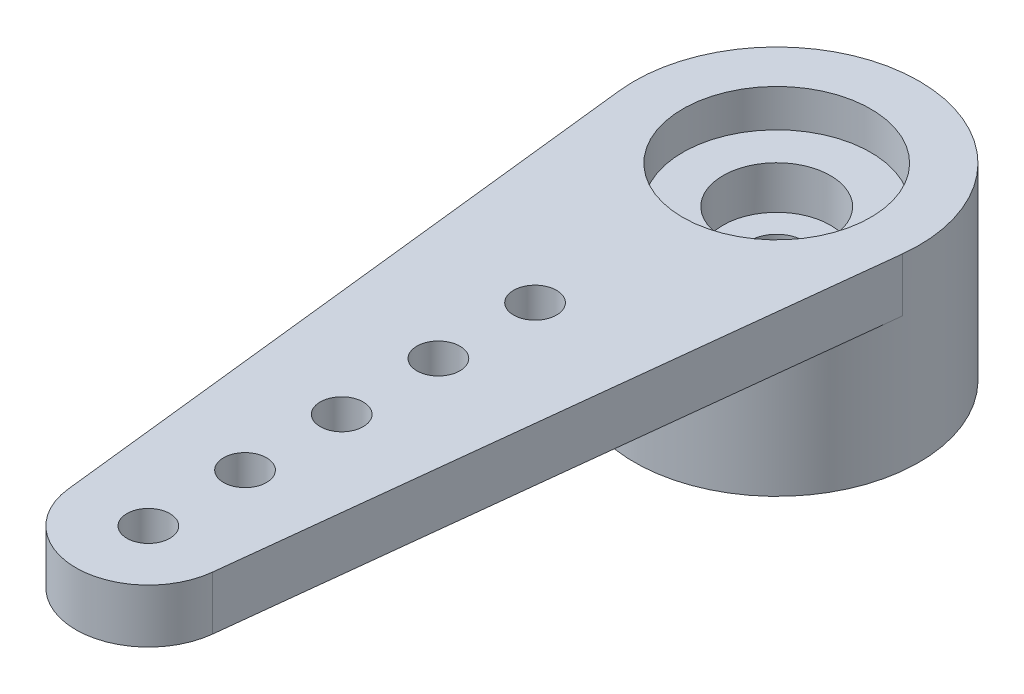
ISO-10303-21;
HEADER;
FILE_DESCRIPTION(('STEP AP214'),'2;1');
FILE_NAME('part.step','',(''),(''),'','','');
FILE_SCHEMA(('AUTOMOTIVE_DESIGN { 1 0 10303 214 1 1 1 1 }'));
ENDSEC;
DATA;
#1=APPLICATION_CONTEXT('core data for automotive mechanical design processes');
#2=APPLICATION_PROTOCOL_DEFINITION('international standard','automotive_design',2000,#1);
#3=PRODUCT_CONTEXT('',#1,'mechanical');
#4=PRODUCT('Part','Part','',(#3));
#5=PRODUCT_RELATED_PRODUCT_CATEGORY('part','',(#4));
#6=PRODUCT_DEFINITION_FORMATION('','',#4);
#7=PRODUCT_DEFINITION_CONTEXT('part definition',#1,'design');
#8=PRODUCT_DEFINITION('design','',#6,#7);
#9=PRODUCT_DEFINITION_SHAPE('','',#8);
#10=(LENGTH_UNIT() NAMED_UNIT(*) SI_UNIT(.MILLI.,.METRE.));
#11=(NAMED_UNIT(*) PLANE_ANGLE_UNIT() SI_UNIT($,.RADIAN.));
#12=(NAMED_UNIT(*) SI_UNIT($,.STERADIAN.) SOLID_ANGLE_UNIT());
#13=UNCERTAINTY_MEASURE_WITH_UNIT(LENGTH_MEASURE(1.E-05),#10,'distance_accuracy_value','');
#14=(GEOMETRIC_REPRESENTATION_CONTEXT(3) GLOBAL_UNCERTAINTY_ASSIGNED_CONTEXT((#13)) GLOBAL_UNIT_ASSIGNED_CONTEXT((#10,
#11,#12)) REPRESENTATION_CONTEXT('',''));
#15=CARTESIAN_POINT('',(0.,0.,0.));
#16=DIRECTION('',(0.,0.,1.));
#17=DIRECTION('',(1.,0.,0.));
#18=AXIS2_PLACEMENT_3D('',#15,#16,#17);
#19=CARTESIAN_POINT('',(0.,-3.176,0.));
#20=DIRECTION('',(0.,1.,0.));
#21=DIRECTION('',(0.,0.,1.));
#22=AXIS2_PLACEMENT_3D('',#19,#20,#21);
#23=CYLINDRICAL_SURFACE('',#22,1.27);
#24=CARTESIAN_POINT('',(0.,0.381,0.));
#25=DIRECTION('',(0.,1.,0.));
#26=DIRECTION('',(0.,0.,1.));
#27=AXIS2_PLACEMENT_3D('',#24,#25,#26);
#28=CIRCLE('',#27,1.27);
#29=CARTESIAN_POINT('',(0.,0.381,1.27));
#30=VERTEX_POINT('',#29);
#31=EDGE_CURVE('E244',#30,#30,#28,.T.);
#32=ORIENTED_EDGE('',*,*,#31,.T.);
#33=EDGE_LOOP('',(#32));
#34=FACE_BOUND('',#33,.T.);
#35=CARTESIAN_POINT('',(0.,-0.635,0.));
#36=DIRECTION('',(0.,-1.,0.));
#37=DIRECTION('',(0.,0.,-1.));
#38=AXIS2_PLACEMENT_3D('',#35,#36,#37);
#39=CIRCLE('',#38,1.27);
#40=CARTESIAN_POINT('',(0.,-0.635,-1.27));
#41=VERTEX_POINT('',#40);
#42=EDGE_CURVE('E11',#41,#41,#39,.F.);
#43=ORIENTED_EDGE('',*,*,#42,.F.);
#44=EDGE_LOOP('',(#43));
#45=FACE_BOUND('',#44,.T.);
#46=ADVANCED_FACE('F45',(#34,#45),#23,.F.);
#47=CARTESIAN_POINT('',(0.,0.,14.859));
#48=DIRECTION('',(0.,1.,0.));
#49=DIRECTION('',(0.,0.,1.));
#50=AXIS2_PLACEMENT_3D('',#47,#48,#49);
#51=PLANE('',#50);
#52=CARTESIAN_POINT('',(0.,0.,5.715));
#53=DIRECTION('',(0.,1.,0.));
#54=DIRECTION('',(0.,0.,1.));
#55=AXIS2_PLACEMENT_3D('',#52,#53,#54);
#56=CIRCLE('',#55,0.508);
#57=CARTESIAN_POINT('',(0.,0.,6.223));
#58=VERTEX_POINT('',#57);
#59=EDGE_CURVE('E208',#58,#58,#56,.F.);
#60=ORIENTED_EDGE('',*,*,#59,.F.);
#61=EDGE_LOOP('',(#60));
#62=FACE_BOUND('',#61,.T.);
#63=CARTESIAN_POINT('',(0.,0.,8.001));
#64=DIRECTION('',(0.,1.,0.));
#65=DIRECTION('',(0.,0.,1.));
#66=AXIS2_PLACEMENT_3D('',#63,#64,#65);
#67=CIRCLE('',#66,0.508);
#68=CARTESIAN_POINT('',(0.,0.,8.509));
#69=VERTEX_POINT('',#68);
#70=EDGE_CURVE('E216',#69,#69,#67,.F.);
#71=ORIENTED_EDGE('',*,*,#70,.F.);
#72=EDGE_LOOP('',(#71));
#73=FACE_BOUND('',#72,.T.);
#74=CARTESIAN_POINT('',(0.,0.,10.287));
#75=DIRECTION('',(0.,1.,0.));
#76=DIRECTION('',(0.,0.,1.));
#77=AXIS2_PLACEMENT_3D('',#74,#75,#76);
#78=CIRCLE('',#77,0.508);
#79=CARTESIAN_POINT('',(0.,0.,10.795));
#80=VERTEX_POINT('',#79);
#81=EDGE_CURVE('E224',#80,#80,#78,.F.);
#82=ORIENTED_EDGE('',*,*,#81,.F.);
#83=EDGE_LOOP('',(#82));
#84=FACE_BOUND('',#83,.T.);
#85=CARTESIAN_POINT('',(0.,0.,12.573));
#86=DIRECTION('',(0.,1.,0.));
#87=DIRECTION('',(0.,0.,1.));
#88=AXIS2_PLACEMENT_3D('',#85,#86,#87);
#89=CIRCLE('',#88,0.508);
#90=CARTESIAN_POINT('',(0.,0.,13.081));
#91=VERTEX_POINT('',#90);
#92=EDGE_CURVE('E232',#91,#91,#89,.F.);
#93=ORIENTED_EDGE('',*,*,#92,.F.);
#94=EDGE_LOOP('',(#93));
#95=FACE_BOUND('',#94,.T.);
#96=CARTESIAN_POINT('',(0.,0.,14.859));
#97=DIRECTION('',(0.,1.,0.));
#98=DIRECTION('',(0.,0.,1.));
#99=AXIS2_PLACEMENT_3D('',#96,#97,#98);
#100=CIRCLE('',#99,0.508);
#101=CARTESIAN_POINT('',(0.,0.,15.367));
#102=VERTEX_POINT('',#101);
#103=EDGE_CURVE('E240',#102,#102,#100,.F.);
#104=ORIENTED_EDGE('',*,*,#103,.F.);
#105=EDGE_LOOP('',(#104));
#106=FACE_BOUND('',#105,.T.);
#107=CARTESIAN_POINT('',(0.,0.,0.));
#108=DIRECTION('',(0.,-1.,0.));
#109=DIRECTION('',(0.,0.,-1.));
#110=AXIS2_PLACEMENT_3D('',#107,#108,#109);
#111=CIRCLE('',#110,3.3655);
#112=CARTESIAN_POINT('',(3.34466079034469,0.,0.373944444444445));
#113=VERTEX_POINT('',#112);
#114=CARTESIAN_POINT('',(-3.34466079034469,0.,0.373944444444445));
#115=VERTEX_POINT('',#114);
#116=EDGE_CURVE('E78',#113,#115,#111,.T.);
#117=ORIENTED_EDGE('',*,*,#116,.F.);
#118=DIRECTION('',(0.111111111111111,0.,-0.993807989999907));
#119=VECTOR('',#118,1.);
#120=CARTESIAN_POINT('',(1.70388379885484,0.,15.0495));
#121=LINE('',#120,#119);
#122=CARTESIAN_POINT('',(1.70388379885484,0.,15.0495));
#123=VERTEX_POINT('',#122);
#124=EDGE_CURVE('E98',#123,#113,#121,.T.);
#125=ORIENTED_EDGE('',*,*,#124,.F.);
#126=CARTESIAN_POINT('',(0.,0.,14.859));
#127=DIRECTION('',(0.,1.,0.));
#128=DIRECTION('',(0.,0.,1.));
#129=AXIS2_PLACEMENT_3D('',#126,#127,#128);
#130=CIRCLE('',#129,1.7145);
#131=CARTESIAN_POINT('',(-1.70388379885484,0.,15.0495));
#132=VERTEX_POINT('',#131);
#133=EDGE_CURVE('E109',#132,#123,#130,.T.);
#134=ORIENTED_EDGE('',*,*,#133,.F.);
#135=DIRECTION('',(0.111111111111111,0.,0.993807989999907));
#136=VECTOR('',#135,1.);
#137=CARTESIAN_POINT('',(-1.70388379885484,0.,15.0495));
#138=LINE('',#137,#136);
#139=EDGE_CURVE('E84',#115,#132,#138,.T.);
#140=ORIENTED_EDGE('',*,*,#139,.F.);
#141=EDGE_LOOP('',(#117,#125,#134,#140));
#142=FACE_BOUND('',#141,.T.);
#143=ADVANCED_FACE('F96',(#62,#73,#84,#95,#106,#142),#51,.F.);
#144=CARTESIAN_POINT('',(0.,1.27,14.859));
#145=DIRECTION('',(0.,-1.,0.));
#146=DIRECTION('',(0.,0.,-1.));
#147=AXIS2_PLACEMENT_3D('',#144,#145,#146);
#148=CYLINDRICAL_SURFACE('',#147,1.7145);
#149=ORIENTED_EDGE('',*,*,#133,.T.);
#150=DIRECTION('',(0.,-1.,0.));
#151=VECTOR('',#150,1.);
#152=CARTESIAN_POINT('',(1.70388379885484,1.27,15.0495));
#153=LINE('',#152,#151);
#154=CARTESIAN_POINT('',(1.70388379885484,1.27,15.0495));
#155=VERTEX_POINT('',#154);
#156=EDGE_CURVE('E55',#155,#123,#153,.T.);
#157=ORIENTED_EDGE('',*,*,#156,.F.);
#158=CARTESIAN_POINT('',(0.,1.27,14.859));
#159=DIRECTION('',(0.,1.,0.));
#160=DIRECTION('',(0.,0.,1.));
#161=AXIS2_PLACEMENT_3D('',#158,#159,#160);
#162=CIRCLE('',#161,1.7145);
#163=CARTESIAN_POINT('',(-1.70388379885484,1.27,15.0495));
#164=VERTEX_POINT('',#163);
#165=EDGE_CURVE('E130',#164,#155,#162,.T.);
#166=ORIENTED_EDGE('',*,*,#165,.F.);
#167=DIRECTION('',(0.,-1.,0.));
#168=VECTOR('',#167,1.);
#169=CARTESIAN_POINT('',(-1.70388379885484,1.27,15.0495));
#170=LINE('',#169,#168);
#171=EDGE_CURVE('E120',#164,#132,#170,.T.);
#172=ORIENTED_EDGE('',*,*,#171,.T.);
#173=EDGE_LOOP('',(#149,#157,#166,#172));
#174=FACE_BOUND('',#173,.T.);
#175=ADVANCED_FACE('F47',(#174),#148,.T.);
#176=CARTESIAN_POINT('',(1.70388379885484,1.27,15.0495));
#177=DIRECTION('',(-0.993807989999906,0.,-0.111111111111111));
#178=DIRECTION('',(-0.111111111111111,0.,0.993807989999906));
#179=AXIS2_PLACEMENT_3D('',#176,#177,#178);
#180=PLANE('',#179);
#181=ORIENTED_EDGE('',*,*,#124,.T.);
#182=DIRECTION('',(0.,-1.,0.));
#183=VECTOR('',#182,1.);
#184=CARTESIAN_POINT('',(3.34466079034469,1.27,0.373944444444445));
#185=LINE('',#184,#183);
#186=CARTESIAN_POINT('',(3.34466079034469,1.27,0.373944444444445));
#187=VERTEX_POINT('',#186);
#188=EDGE_CURVE('E104',#187,#113,#185,.T.);
#189=ORIENTED_EDGE('',*,*,#188,.F.);
#190=DIRECTION('',(0.111111111111111,0.,-0.993807989999907));
#191=VECTOR('',#190,1.);
#192=CARTESIAN_POINT('',(1.70388379885484,1.27,15.0495));
#193=LINE('',#192,#191);
#194=EDGE_CURVE('E92',#155,#187,#193,.T.);
#195=ORIENTED_EDGE('',*,*,#194,.F.);
#196=ORIENTED_EDGE('',*,*,#156,.T.);
#197=EDGE_LOOP('',(#181,#189,#195,#196));
#198=FACE_BOUND('',#197,.T.);
#199=ADVANCED_FACE('F103',(#198),#180,.F.);
#200=CARTESIAN_POINT('',(0.,1.27,0.));
#201=DIRECTION('',(0.,-1.,0.));
#202=DIRECTION('',(0.,0.,-1.));
#203=AXIS2_PLACEMENT_3D('',#200,#201,#202);
#204=CYLINDRICAL_SURFACE('',#203,3.3655);
#205=ORIENTED_EDGE('',*,*,#188,.T.);
#206=ORIENTED_EDGE('',*,*,#116,.T.);
#207=DIRECTION('',(0.,-1.,0.));
#208=VECTOR('',#207,1.);
#209=CARTESIAN_POINT('',(-3.34466079034469,1.27,0.373944444444445));
#210=LINE('',#209,#208);
#211=CARTESIAN_POINT('',(-3.34466079034469,1.27,0.373944444444445));
#212=VERTEX_POINT('',#211);
#213=EDGE_CURVE('E115',#212,#115,#210,.T.);
#214=ORIENTED_EDGE('',*,*,#213,.F.);
#215=CARTESIAN_POINT('',(0.,1.27,0.));
#216=DIRECTION('',(0.,1.,0.));
#217=DIRECTION('',(0.,0.,1.));
#218=AXIS2_PLACEMENT_3D('',#215,#216,#217);
#219=CIRCLE('',#218,3.3655);
#220=EDGE_CURVE('E113',#187,#212,#219,.T.);
#221=ORIENTED_EDGE('',*,*,#220,.F.);
#222=EDGE_LOOP('',(#205,#206,#214,#221));
#223=FACE_BOUND('',#222,.T.);
#224=CARTESIAN_POINT('',(0.,-3.175,0.));
#225=DIRECTION('',(0.,-1.,0.));
#226=DIRECTION('',(0.,0.,-1.));
#227=AXIS2_PLACEMENT_3D('',#224,#225,#226);
#228=CIRCLE('',#227,3.3655);
#229=CARTESIAN_POINT('',(0.,-3.175,-3.3655));
#230=VERTEX_POINT('',#229);
#231=EDGE_CURVE('E100',#230,#230,#228,.T.);
#232=ORIENTED_EDGE('',*,*,#231,.F.);
#233=EDGE_LOOP('',(#232));
#234=FACE_BOUND('',#233,.T.);
#235=ADVANCED_FACE('F111',(#223,#234),#204,.T.);
#236=CARTESIAN_POINT('',(-1.70388379885484,1.27,15.0495));
#237=DIRECTION('',(0.993807989999906,0.,-0.111111111111111));
#238=DIRECTION('',(-0.111111111111111,0.,-0.993807989999906));
#239=AXIS2_PLACEMENT_3D('',#236,#237,#238);
#240=PLANE('',#239);
#241=ORIENTED_EDGE('',*,*,#139,.T.);
#242=ORIENTED_EDGE('',*,*,#171,.F.);
#243=DIRECTION('',(0.111111111111111,0.,0.993807989999907));
#244=VECTOR('',#243,1.);
#245=CARTESIAN_POINT('',(-1.70388379885484,1.27,15.0495));
#246=LINE('',#245,#244);
#247=EDGE_CURVE('E63',#212,#164,#246,.T.);
#248=ORIENTED_EDGE('',*,*,#247,.F.);
#249=ORIENTED_EDGE('',*,*,#213,.T.);
#250=EDGE_LOOP('',(#241,#242,#248,#249));
#251=FACE_BOUND('',#250,.T.);
#252=ADVANCED_FACE('F150',(#251),#240,.F.);
#253=CARTESIAN_POINT('',(0.,1.27,14.859));
#254=DIRECTION('',(0.,1.,0.));
#255=DIRECTION('',(0.,0.,1.));
#256=AXIS2_PLACEMENT_3D('',#253,#254,#255);
#257=PLANE('',#256);
#258=CARTESIAN_POINT('',(0.,1.27,5.715));
#259=DIRECTION('',(0.,1.,0.));
#260=DIRECTION('',(0.,0.,1.));
#261=AXIS2_PLACEMENT_3D('',#258,#259,#260);
#262=CIRCLE('',#261,0.508);
#263=CARTESIAN_POINT('',(0.,1.27,6.223));
#264=VERTEX_POINT('',#263);
#265=EDGE_CURVE('E202',#264,#264,#262,.T.);
#266=ORIENTED_EDGE('',*,*,#265,.F.);
#267=EDGE_LOOP('',(#266));
#268=FACE_BOUND('',#267,.T.);
#269=CARTESIAN_POINT('',(0.,1.27,8.001));
#270=DIRECTION('',(0.,1.,0.));
#271=DIRECTION('',(0.,0.,1.));
#272=AXIS2_PLACEMENT_3D('',#269,#270,#271);
#273=CIRCLE('',#272,0.508);
#274=CARTESIAN_POINT('',(0.,1.27,8.509));
#275=VERTEX_POINT('',#274);
#276=EDGE_CURVE('E212',#275,#275,#273,.T.);
#277=ORIENTED_EDGE('',*,*,#276,.F.);
#278=EDGE_LOOP('',(#277));
#279=FACE_BOUND('',#278,.T.);
#280=CARTESIAN_POINT('',(0.,1.27,10.287));
#281=DIRECTION('',(0.,1.,0.));
#282=DIRECTION('',(0.,0.,1.));
#283=AXIS2_PLACEMENT_3D('',#280,#281,#282);
#284=CIRCLE('',#283,0.508);
#285=CARTESIAN_POINT('',(0.,1.27,10.795));
#286=VERTEX_POINT('',#285);
#287=EDGE_CURVE('E220',#286,#286,#284,.T.);
#288=ORIENTED_EDGE('',*,*,#287,.F.);
#289=EDGE_LOOP('',(#288));
#290=FACE_BOUND('',#289,.T.);
#291=CARTESIAN_POINT('',(0.,1.27,12.573));
#292=DIRECTION('',(0.,1.,0.));
#293=DIRECTION('',(0.,0.,1.));
#294=AXIS2_PLACEMENT_3D('',#291,#292,#293);
#295=CIRCLE('',#294,0.508);
#296=CARTESIAN_POINT('',(0.,1.27,13.081));
#297=VERTEX_POINT('',#296);
#298=EDGE_CURVE('E228',#297,#297,#295,.T.);
#299=ORIENTED_EDGE('',*,*,#298,.F.);
#300=EDGE_LOOP('',(#299));
#301=FACE_BOUND('',#300,.T.);
#302=CARTESIAN_POINT('',(0.,1.27,14.859));
#303=DIRECTION('',(0.,1.,0.));
#304=DIRECTION('',(0.,0.,1.));
#305=AXIS2_PLACEMENT_3D('',#302,#303,#304);
#306=CIRCLE('',#305,0.508);
#307=CARTESIAN_POINT('',(0.,1.27,15.367));
#308=VERTEX_POINT('',#307);
#309=EDGE_CURVE('E236',#308,#308,#306,.T.);
#310=ORIENTED_EDGE('',*,*,#309,.F.);
#311=EDGE_LOOP('',(#310));
#312=FACE_BOUND('',#311,.T.);
#313=CARTESIAN_POINT('',(0.,1.27,0.));
#314=DIRECTION('',(0.,1.,0.));
#315=DIRECTION('',(0.,0.,1.));
#316=AXIS2_PLACEMENT_3D('',#313,#314,#315);
#317=CIRCLE('',#316,2.2225);
#318=CARTESIAN_POINT('',(0.,1.27,2.2225));
#319=VERTEX_POINT('',#318);
#320=EDGE_CURVE('E247',#319,#319,#317,.T.);
#321=ORIENTED_EDGE('',*,*,#320,.F.);
#322=EDGE_LOOP('',(#321));
#323=FACE_BOUND('',#322,.T.);
#324=ORIENTED_EDGE('',*,*,#165,.T.);
#325=ORIENTED_EDGE('',*,*,#194,.T.);
#326=ORIENTED_EDGE('',*,*,#220,.T.);
#327=ORIENTED_EDGE('',*,*,#247,.T.);
#328=EDGE_LOOP('',(#324,#325,#326,#327));
#329=FACE_BOUND('',#328,.T.);
#330=ADVANCED_FACE('F152',(#268,#279,#290,#301,#312,#323,#329),#257,.T.);
#331=CARTESIAN_POINT('',(0.,-3.175,0.));
#332=DIRECTION('',(0.,-1.,0.));
#333=DIRECTION('',(0.,0.,-1.));
#334=AXIS2_PLACEMENT_3D('',#331,#332,#333);
#335=PLANE('',#334);
#336=ORIENTED_EDGE('',*,*,#231,.T.);
#337=EDGE_LOOP('',(#336));
#338=FACE_BOUND('',#337,.T.);
#339=CARTESIAN_POINT('',(0.,-3.175,0.));
#340=DIRECTION('',(0.,-1.,0.));
#341=DIRECTION('',(0.,0.,-1.));
#342=AXIS2_PLACEMENT_3D('',#339,#340,#341);
#343=CIRCLE('',#342,0.635);
#344=CARTESIAN_POINT('',(0.,-3.175,-0.635));
#345=VERTEX_POINT('',#344);
#346=EDGE_CURVE('E195',#345,#345,#343,.T.);
#347=ORIENTED_EDGE('',*,*,#346,.F.);
#348=EDGE_LOOP('',(#347));
#349=FACE_BOUND('',#348,.T.);
#350=ADVANCED_FACE('F159',(#338,#349),#335,.T.);
#351=CARTESIAN_POINT('',(0.,0.381,0.));
#352=DIRECTION('',(0.,1.,0.));
#353=DIRECTION('',(0.,0.,1.));
#354=AXIS2_PLACEMENT_3D('',#351,#352,#353);
#355=CYLINDRICAL_SURFACE('',#354,2.2225);
#356=CARTESIAN_POINT('',(0.,0.381,0.));
#357=DIRECTION('',(0.,1.,0.));
#358=DIRECTION('',(0.,0.,1.));
#359=AXIS2_PLACEMENT_3D('',#356,#357,#358);
#360=CIRCLE('',#359,2.2225);
#361=CARTESIAN_POINT('',(0.,0.381,2.2225));
#362=VERTEX_POINT('',#361);
#363=EDGE_CURVE('E101',#362,#362,#360,.T.);
#364=ORIENTED_EDGE('',*,*,#363,.F.);
#365=EDGE_LOOP('',(#364));
#366=FACE_BOUND('',#365,.T.);
#367=ORIENTED_EDGE('',*,*,#320,.T.);
#368=EDGE_LOOP('',(#367));
#369=FACE_BOUND('',#368,.T.);
#370=ADVANCED_FACE('F182',(#366,#369),#355,.F.);
#371=CARTESIAN_POINT('',(0.,0.381,0.));
#372=DIRECTION('',(0.,1.,0.));
#373=DIRECTION('',(0.,0.,1.));
#374=AXIS2_PLACEMENT_3D('',#371,#372,#373);
#375=PLANE('',#374);
#376=ORIENTED_EDGE('',*,*,#31,.F.);
#377=EDGE_LOOP('',(#376));
#378=FACE_BOUND('',#377,.T.);
#379=ORIENTED_EDGE('',*,*,#363,.T.);
#380=EDGE_LOOP('',(#379));
#381=FACE_BOUND('',#380,.T.);
#382=ADVANCED_FACE('F179',(#378,#381),#375,.T.);
#383=CARTESIAN_POINT('',(0.,-3.176,14.859));
#384=DIRECTION('',(0.,1.,0.));
#385=DIRECTION('',(0.,0.,1.));
#386=AXIS2_PLACEMENT_3D('',#383,#384,#385);
#387=CYLINDRICAL_SURFACE('',#386,0.508);
#388=ORIENTED_EDGE('',*,*,#309,.T.);
#389=EDGE_LOOP('',(#388));
#390=FACE_BOUND('',#389,.T.);
#391=ORIENTED_EDGE('',*,*,#103,.T.);
#392=EDGE_LOOP('',(#391));
#393=FACE_BOUND('',#392,.T.);
#394=ADVANCED_FACE('F177',(#390,#393),#387,.F.);
#395=CARTESIAN_POINT('',(0.,-3.176,12.573));
#396=DIRECTION('',(0.,1.,0.));
#397=DIRECTION('',(0.,0.,1.));
#398=AXIS2_PLACEMENT_3D('',#395,#396,#397);
#399=CYLINDRICAL_SURFACE('',#398,0.508);
#400=ORIENTED_EDGE('',*,*,#298,.T.);
#401=EDGE_LOOP('',(#400));
#402=FACE_BOUND('',#401,.T.);
#403=ORIENTED_EDGE('',*,*,#92,.T.);
#404=EDGE_LOOP('',(#403));
#405=FACE_BOUND('',#404,.T.);
#406=ADVANCED_FACE('F263',(#402,#405),#399,.F.);
#407=CARTESIAN_POINT('',(0.,-3.176,10.287));
#408=DIRECTION('',(0.,1.,0.));
#409=DIRECTION('',(0.,0.,1.));
#410=AXIS2_PLACEMENT_3D('',#407,#408,#409);
#411=CYLINDRICAL_SURFACE('',#410,0.508);
#412=ORIENTED_EDGE('',*,*,#287,.T.);
#413=EDGE_LOOP('',(#412));
#414=FACE_BOUND('',#413,.T.);
#415=ORIENTED_EDGE('',*,*,#81,.T.);
#416=EDGE_LOOP('',(#415));
#417=FACE_BOUND('',#416,.T.);
#418=ADVANCED_FACE('F268',(#414,#417),#411,.F.);
#419=CARTESIAN_POINT('',(0.,-3.176,8.001));
#420=DIRECTION('',(0.,1.,0.));
#421=DIRECTION('',(0.,0.,1.));
#422=AXIS2_PLACEMENT_3D('',#419,#420,#421);
#423=CYLINDRICAL_SURFACE('',#422,0.508);
#424=ORIENTED_EDGE('',*,*,#276,.T.);
#425=EDGE_LOOP('',(#424));
#426=FACE_BOUND('',#425,.T.);
#427=ORIENTED_EDGE('',*,*,#70,.T.);
#428=EDGE_LOOP('',(#427));
#429=FACE_BOUND('',#428,.T.);
#430=ADVANCED_FACE('F275',(#426,#429),#423,.F.);
#431=CARTESIAN_POINT('',(0.,-3.176,5.715));
#432=DIRECTION('',(0.,1.,0.));
#433=DIRECTION('',(0.,0.,1.));
#434=AXIS2_PLACEMENT_3D('',#431,#432,#433);
#435=CYLINDRICAL_SURFACE('',#434,0.508);
#436=ORIENTED_EDGE('',*,*,#265,.T.);
#437=EDGE_LOOP('',(#436));
#438=FACE_BOUND('',#437,.T.);
#439=ORIENTED_EDGE('',*,*,#59,.T.);
#440=EDGE_LOOP('',(#439));
#441=FACE_BOUND('',#440,.T.);
#442=ADVANCED_FACE('F282',(#438,#441),#435,.F.);
#443=CARTESIAN_POINT('',(0.,-0.635,0.));
#444=DIRECTION('',(0.,-1.,0.));
#445=DIRECTION('',(0.,0.,-1.));
#446=AXIS2_PLACEMENT_3D('',#443,#444,#445);
#447=PLANE('',#446);
#448=CARTESIAN_POINT('',(0.,-0.635,0.));
#449=DIRECTION('',(0.,-1.,0.));
#450=DIRECTION('',(0.,0.,-1.));
#451=AXIS2_PLACEMENT_3D('',#448,#449,#450);
#452=CIRCLE('',#451,0.635);
#453=CARTESIAN_POINT('',(0.,-0.635,-0.635));
#454=VERTEX_POINT('',#453);
#455=EDGE_CURVE('E198',#454,#454,#452,.T.);
#456=ORIENTED_EDGE('',*,*,#455,.T.);
#457=EDGE_LOOP('',(#456));
#458=FACE_BOUND('',#457,.T.);
#459=ORIENTED_EDGE('',*,*,#42,.T.);
#460=EDGE_LOOP('',(#459));
#461=FACE_BOUND('',#460,.T.);
#462=ADVANCED_FACE('F285',(#458,#461),#447,.F.);
#463=CARTESIAN_POINT('',(0.,-0.635,0.));
#464=DIRECTION('',(0.,-1.,0.));
#465=DIRECTION('',(0.,0.,-1.));
#466=AXIS2_PLACEMENT_3D('',#463,#464,#465);
#467=CYLINDRICAL_SURFACE('',#466,0.635);
#468=ORIENTED_EDGE('',*,*,#455,.F.);
#469=EDGE_LOOP('',(#468));
#470=FACE_BOUND('',#469,.T.);
#471=ORIENTED_EDGE('',*,*,#346,.T.);
#472=EDGE_LOOP('',(#471));
#473=FACE_BOUND('',#472,.T.);
#474=ADVANCED_FACE('F288',(#470,#473),#467,.F.);
#475=CLOSED_SHELL('',(#46,#143,#175,#199,#235,#252,#330,#350,#370,#382,#394,#406,#418,#430,#442,
#462,#474));
#476=MANIFOLD_SOLID_BREP('B2',#475);
#477=ADVANCED_BREP_SHAPE_REPRESENTATION('',(#18,#476),#14);
#478=SHAPE_DEFINITION_REPRESENTATION(#9,#477);
ENDSEC;
END-ISO-10303-21;
